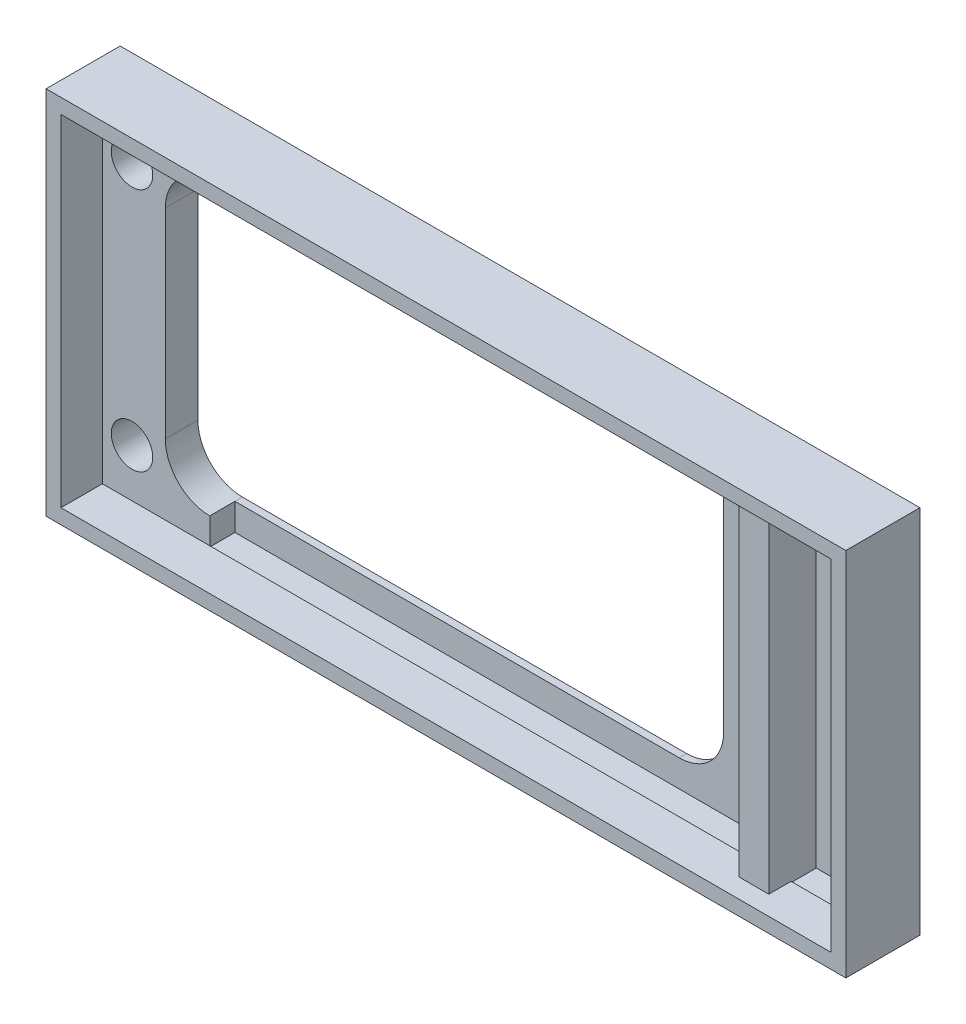
ISO-10303-21;
HEADER;
FILE_DESCRIPTION(('STEP AP214'),'2;1');
FILE_NAME('part.step','',(''),(''),'','','');
FILE_SCHEMA(('AUTOMOTIVE_DESIGN { 1 0 10303 214 1 1 1 1 }'));
ENDSEC;
DATA;
#1=APPLICATION_CONTEXT('core data for automotive mechanical design processes');
#2=APPLICATION_PROTOCOL_DEFINITION('international standard','automotive_design',2000,#1);
#3=PRODUCT_CONTEXT('',#1,'mechanical');
#4=PRODUCT('Part','Part','',(#3));
#5=PRODUCT_RELATED_PRODUCT_CATEGORY('part','',(#4));
#6=PRODUCT_DEFINITION_FORMATION('','',#4);
#7=PRODUCT_DEFINITION_CONTEXT('part definition',#1,'design');
#8=PRODUCT_DEFINITION('design','',#6,#7);
#9=PRODUCT_DEFINITION_SHAPE('','',#8);
#10=(LENGTH_UNIT() NAMED_UNIT(*) SI_UNIT(.MILLI.,.METRE.));
#11=(NAMED_UNIT(*) PLANE_ANGLE_UNIT() SI_UNIT($,.RADIAN.));
#12=(NAMED_UNIT(*) SI_UNIT($,.STERADIAN.) SOLID_ANGLE_UNIT());
#13=UNCERTAINTY_MEASURE_WITH_UNIT(LENGTH_MEASURE(1.E-05),#10,'distance_accuracy_value','');
#14=(GEOMETRIC_REPRESENTATION_CONTEXT(3) GLOBAL_UNCERTAINTY_ASSIGNED_CONTEXT((#13)) GLOBAL_UNIT_ASSIGNED_CONTEXT((#10,
#11,#12)) REPRESENTATION_CONTEXT('',''));
#15=CARTESIAN_POINT('',(0.,0.,0.));
#16=DIRECTION('',(0.,0.,1.));
#17=DIRECTION('',(1.,0.,0.));
#18=AXIS2_PLACEMENT_3D('',#15,#16,#17);
#19=CARTESIAN_POINT('',(-26.,11.5,5.));
#20=DIRECTION('',(0.,-1.,0.));
#21=DIRECTION('',(0.,0.,-1.));
#22=AXIS2_PLACEMENT_3D('',#19,#20,#21);
#23=PLANE('',#22);
#24=DIRECTION('',(-1.,0.,0.));
#25=VECTOR('',#24,1.);
#26=CARTESIAN_POINT('',(26.,11.5,0.5));
#27=LINE('',#26,#25);
#28=CARTESIAN_POINT('',(18.5,11.5,0.5));
#29=VERTEX_POINT('',#28);
#30=CARTESIAN_POINT('',(-18.75,11.5,0.5));
#31=VERTEX_POINT('',#30);
#32=EDGE_CURVE('E539',#29,#31,#27,.T.);
#33=ORIENTED_EDGE('',*,*,#32,.F.);
#34=DIRECTION('',(0.,0.,-1.));
#35=VECTOR('',#34,1.);
#36=CARTESIAN_POINT('',(18.5,11.5,3.7));
#37=LINE('',#36,#35);
#38=CARTESIAN_POINT('',(18.5,11.5,3.7));
#39=VERTEX_POINT('',#38);
#40=EDGE_CURVE('E59',#39,#29,#37,.T.);
#41=ORIENTED_EDGE('',*,*,#40,.F.);
#42=DIRECTION('',(-1.,0.,0.));
#43=VECTOR('',#42,1.);
#44=CARTESIAN_POINT('',(18.5,11.5,3.7));
#45=LINE('',#44,#43);
#46=CARTESIAN_POINT('',(20.5,11.5,3.7));
#47=VERTEX_POINT('',#46);
#48=EDGE_CURVE('E63',#47,#39,#45,.T.);
#49=ORIENTED_EDGE('',*,*,#48,.F.);
#50=DIRECTION('',(0.,0.,-1.));
#51=VECTOR('',#50,1.);
#52=CARTESIAN_POINT('',(20.5,11.5,3.7));
#53=LINE('',#52,#51);
#54=CARTESIAN_POINT('',(20.5,11.5,0.5));
#55=VERTEX_POINT('',#54);
#56=EDGE_CURVE('E570',#47,#55,#53,.T.);
#57=ORIENTED_EDGE('',*,*,#56,.T.);
#58=CARTESIAN_POINT('',(26.,11.5,0.5));
#59=VERTEX_POINT('',#58);
#60=EDGE_CURVE('E243',#59,#55,#27,.T.);
#61=ORIENTED_EDGE('',*,*,#60,.F.);
#62=DIRECTION('',(0.,0.,-1.));
#63=VECTOR('',#62,1.);
#64=CARTESIAN_POINT('',(26.,11.5,5.));
#65=LINE('',#64,#63);
#66=CARTESIAN_POINT('',(26.,11.5,5.));
#67=VERTEX_POINT('',#66);
#68=EDGE_CURVE('E333',#67,#59,#65,.T.);
#69=ORIENTED_EDGE('',*,*,#68,.F.);
#70=DIRECTION('',(-1.,0.,0.));
#71=VECTOR('',#70,1.);
#72=CARTESIAN_POINT('',(-26.,11.5,5.));
#73=LINE('',#72,#71);
#74=CARTESIAN_POINT('',(-26.,11.5,5.));
#75=VERTEX_POINT('',#74);
#76=EDGE_CURVE('E472',#67,#75,#73,.T.);
#77=ORIENTED_EDGE('',*,*,#76,.T.);
#78=DIRECTION('',(0.,0.,-1.));
#79=VECTOR('',#78,1.);
#80=CARTESIAN_POINT('',(-26.,11.5,5.));
#81=LINE('',#80,#79);
#82=CARTESIAN_POINT('',(-26.,11.5,2.2));
#83=VERTEX_POINT('',#82);
#84=EDGE_CURVE('E338',#75,#83,#81,.T.);
#85=ORIENTED_EDGE('',*,*,#84,.T.);
#86=DIRECTION('',(1.,0.,0.));
#87=VECTOR('',#86,1.);
#88=CARTESIAN_POINT('',(-26.,11.5,2.2));
#89=LINE('',#88,#87);
#90=CARTESIAN_POINT('',(-19.75,11.5,2.2));
#91=VERTEX_POINT('',#90);
#92=EDGE_CURVE('E467',#83,#91,#89,.T.);
#93=ORIENTED_EDGE('',*,*,#92,.T.);
#94=CARTESIAN_POINT('',(-19.75,11.5,1.2));
#95=DIRECTION('',(0.,-1.,0.));
#96=DIRECTION('',(0.,0.,-1.));
#97=AXIS2_PLACEMENT_3D('',#94,#95,#96);
#98=CIRCLE('',#97,1.);
#99=CARTESIAN_POINT('',(-18.75,11.5,1.2));
#100=VERTEX_POINT('',#99);
#101=EDGE_CURVE('E253',#91,#100,#98,.F.);
#102=ORIENTED_EDGE('',*,*,#101,.T.);
#103=DIRECTION('',(0.,0.,1.));
#104=VECTOR('',#103,1.);
#105=CARTESIAN_POINT('',(-18.75,11.5,0.5));
#106=LINE('',#105,#104);
#107=EDGE_CURVE('E372',#31,#100,#106,.T.);
#108=ORIENTED_EDGE('',*,*,#107,.F.);
#109=EDGE_LOOP('',(#33,#41,#49,#57,#61,#69,#77,#85,#93,#102,#108));
#110=FACE_BOUND('',#109,.T.);
#111=ADVANCED_FACE('F43',(#110),#23,.T.);
#112=CARTESIAN_POINT('',(-26.,-11.5,5.));
#113=DIRECTION('',(0.,1.,0.));
#114=DIRECTION('',(0.,0.,1.));
#115=AXIS2_PLACEMENT_3D('',#112,#113,#114);
#116=PLANE('',#115);
#117=DIRECTION('',(1.,0.,0.));
#118=VECTOR('',#117,1.);
#119=CARTESIAN_POINT('',(-26.,-11.5,3.7));
#120=LINE('',#119,#118);
#121=CARTESIAN_POINT('',(18.5,-11.5,3.7));
#122=VERTEX_POINT('',#121);
#123=CARTESIAN_POINT('',(20.5,-11.5,3.7));
#124=VERTEX_POINT('',#123);
#125=EDGE_CURVE('E11',#122,#124,#120,.T.);
#126=ORIENTED_EDGE('',*,*,#125,.F.);
#127=DIRECTION('',(0.,0.,-1.));
#128=VECTOR('',#127,1.);
#129=CARTESIAN_POINT('',(18.5,-11.5,5.));
#130=LINE('',#129,#128);
#131=CARTESIAN_POINT('',(18.5,-11.5,2.2));
#132=VERTEX_POINT('',#131);
#133=EDGE_CURVE('E550',#122,#132,#130,.T.);
#134=ORIENTED_EDGE('',*,*,#133,.T.);
#135=DIRECTION('',(-1.,0.,0.));
#136=VECTOR('',#135,1.);
#137=CARTESIAN_POINT('',(-26.,-11.5,2.2));
#138=LINE('',#137,#136);
#139=CARTESIAN_POINT('',(-18.75,-11.5,2.2));
#140=VERTEX_POINT('',#139);
#141=EDGE_CURVE('E358',#132,#140,#138,.T.);
#142=ORIENTED_EDGE('',*,*,#141,.T.);
#143=CARTESIAN_POINT('',(-26.,-11.5,2.2));
#144=VERTEX_POINT('',#143);
#145=EDGE_CURVE('E355',#140,#144,#138,.T.);
#146=ORIENTED_EDGE('',*,*,#145,.T.);
#147=DIRECTION('',(0.,0.,-1.));
#148=VECTOR('',#147,1.);
#149=CARTESIAN_POINT('',(-26.,-11.5,5.));
#150=LINE('',#149,#148);
#151=CARTESIAN_POINT('',(-26.,-11.5,5.));
#152=VERTEX_POINT('',#151);
#153=EDGE_CURVE('E482',#152,#144,#150,.T.);
#154=ORIENTED_EDGE('',*,*,#153,.F.);
#155=DIRECTION('',(1.,0.,0.));
#156=VECTOR('',#155,1.);
#157=CARTESIAN_POINT('',(-26.,-11.5,5.));
#158=LINE('',#157,#156);
#159=CARTESIAN_POINT('',(26.,-11.5,5.));
#160=VERTEX_POINT('',#159);
#161=EDGE_CURVE('E477',#152,#160,#158,.T.);
#162=ORIENTED_EDGE('',*,*,#161,.T.);
#163=DIRECTION('',(0.,0.,-1.));
#164=VECTOR('',#163,1.);
#165=CARTESIAN_POINT('',(26.,-11.5,5.));
#166=LINE('',#165,#164);
#167=CARTESIAN_POINT('',(26.,-11.5,2.2));
#168=VERTEX_POINT('',#167);
#169=EDGE_CURVE('E479',#160,#168,#166,.T.);
#170=ORIENTED_EDGE('',*,*,#169,.T.);
#171=CARTESIAN_POINT('',(20.5,-11.5,2.2));
#172=VERTEX_POINT('',#171);
#173=EDGE_CURVE('E356',#168,#172,#138,.T.);
#174=ORIENTED_EDGE('',*,*,#173,.T.);
#175=DIRECTION('',(0.,0.,1.));
#176=VECTOR('',#175,1.);
#177=CARTESIAN_POINT('',(20.5,-11.5,5.));
#178=LINE('',#177,#176);
#179=EDGE_CURVE('E567',#172,#124,#178,.T.);
#180=ORIENTED_EDGE('',*,*,#179,.T.);
#181=EDGE_LOOP('',(#126,#134,#142,#146,#154,#162,#170,#174,#180));
#182=FACE_BOUND('',#181,.T.);
#183=ADVANCED_FACE('F283',(#182),#116,.T.);
#184=CARTESIAN_POINT('',(0.,0.,0.5));
#185=DIRECTION('',(0.,0.,-1.));
#186=DIRECTION('',(-1.,0.,0.));
#187=AXIS2_PLACEMENT_3D('',#184,#185,#186);
#188=PLANE('',#187);
#189=DIRECTION('',(0.,-1.,0.));
#190=VECTOR('',#189,1.);
#191=CARTESIAN_POINT('',(18.5,11.5,0.5));
#192=LINE('',#191,#190);
#193=CARTESIAN_POINT('',(18.5,-11.5719370602204,0.5));
#194=VERTEX_POINT('',#193);
#195=EDGE_CURVE('E247',#29,#194,#192,.T.);
#196=ORIENTED_EDGE('',*,*,#195,.F.);
#197=ORIENTED_EDGE('',*,*,#32,.T.);
#198=DIRECTION('',(0.,-1.,0.));
#199=VECTOR('',#198,1.);
#200=CARTESIAN_POINT('',(-18.75,11.5,0.5));
#201=LINE('',#200,#199);
#202=CARTESIAN_POINT('',(-18.75,9.75,0.5));
#203=VERTEX_POINT('',#202);
#204=EDGE_CURVE('E236',#31,#203,#201,.T.);
#205=ORIENTED_EDGE('',*,*,#204,.T.);
#206=DIRECTION('',(-1.,0.,0.));
#207=VECTOR('',#206,1.);
#208=CARTESIAN_POINT('',(11.25,9.75,0.5));
#209=LINE('',#208,#207);
#210=CARTESIAN_POINT('',(11.25,9.75,0.5));
#211=VERTEX_POINT('',#210);
#212=EDGE_CURVE('E365',#211,#203,#209,.T.);
#213=ORIENTED_EDGE('',*,*,#212,.F.);
#214=CARTESIAN_POINT('',(11.25,6.75,0.5));
#215=DIRECTION('',(0.,0.,-1.));
#216=DIRECTION('',(-1.,0.,0.));
#217=AXIS2_PLACEMENT_3D('',#214,#215,#216);
#218=CIRCLE('',#217,3.);
#219=CARTESIAN_POINT('',(14.25,6.75,0.5));
#220=VERTEX_POINT('',#219);
#221=EDGE_CURVE('E382',#220,#211,#218,.F.);
#222=ORIENTED_EDGE('',*,*,#221,.F.);
#223=DIRECTION('',(0.,1.,0.));
#224=VECTOR('',#223,1.);
#225=CARTESIAN_POINT('',(14.25,-6.75,0.5));
#226=LINE('',#225,#224);
#227=CARTESIAN_POINT('',(14.25,-6.75,0.5));
#228=VERTEX_POINT('',#227);
#229=EDGE_CURVE('E385',#228,#220,#226,.T.);
#230=ORIENTED_EDGE('',*,*,#229,.F.);
#231=CARTESIAN_POINT('',(11.25,-6.75,0.5));
#232=DIRECTION('',(0.,0.,-1.));
#233=DIRECTION('',(-1.,0.,0.));
#234=AXIS2_PLACEMENT_3D('',#231,#232,#233);
#235=CIRCLE('',#234,3.);
#236=CARTESIAN_POINT('',(11.25,-9.75,0.5));
#237=VERTEX_POINT('',#236);
#238=EDGE_CURVE('E388',#237,#228,#235,.F.);
#239=ORIENTED_EDGE('',*,*,#238,.F.);
#240=DIRECTION('',(1.,0.,0.));
#241=VECTOR('',#240,1.);
#242=CARTESIAN_POINT('',(11.25,-9.75,0.5));
#243=LINE('',#242,#241);
#244=CARTESIAN_POINT('',(-18.75,-9.75,0.5));
#245=VERTEX_POINT('',#244);
#246=EDGE_CURVE('E391',#245,#237,#243,.T.);
#247=ORIENTED_EDGE('',*,*,#246,.F.);
#248=CARTESIAN_POINT('',(-18.75,-11.5719370602204,0.5));
#249=VERTEX_POINT('',#248);
#250=EDGE_CURVE('E542',#245,#249,#201,.T.);
#251=ORIENTED_EDGE('',*,*,#250,.T.);
#252=DIRECTION('',(1.,0.,0.));
#253=VECTOR('',#252,1.);
#254=CARTESIAN_POINT('',(26.,-11.5719370602204,0.5));
#255=LINE('',#254,#253);
#256=EDGE_CURVE('E235',#249,#194,#255,.T.);
#257=ORIENTED_EDGE('',*,*,#256,.T.);
#258=EDGE_LOOP('',(#196,#197,#205,#213,#222,#230,#239,#247,#251,#257));
#259=FACE_BOUND('',#258,.T.);
#260=ADVANCED_FACE('F286',(#259),#188,.F.);
#261=CARTESIAN_POINT('',(23.,8.24999999999999,0.5));
#262=DIRECTION('',(0.,0.,-1.));
#263=DIRECTION('',(-1.,0.,0.));
#264=AXIS2_PLACEMENT_3D('',#261,#262,#263);
#265=CIRCLE('',#264,1.4);
#266=CARTESIAN_POINT('',(21.6,8.24999999999999,0.5));
#267=VERTEX_POINT('',#266);
#268=EDGE_CURVE('E361',#267,#267,#265,.F.);
#269=ORIENTED_EDGE('',*,*,#268,.F.);
#270=EDGE_LOOP('',(#269));
#271=FACE_BOUND('',#270,.T.);
#272=CARTESIAN_POINT('',(23.,-8.25000000000001,0.5));
#273=DIRECTION('',(0.,0.,-1.));
#274=DIRECTION('',(-1.,0.,0.));
#275=AXIS2_PLACEMENT_3D('',#272,#273,#274);
#276=CIRCLE('',#275,1.4);
#277=CARTESIAN_POINT('',(21.6,-8.25000000000001,0.5));
#278=VERTEX_POINT('',#277);
#279=EDGE_CURVE('E359',#278,#278,#276,.F.);
#280=ORIENTED_EDGE('',*,*,#279,.F.);
#281=EDGE_LOOP('',(#280));
#282=FACE_BOUND('',#281,.T.);
#283=DIRECTION('',(0.,1.,0.));
#284=VECTOR('',#283,1.);
#285=CARTESIAN_POINT('',(20.5,11.5,0.5));
#286=LINE('',#285,#284);
#287=CARTESIAN_POINT('',(20.5,-11.5719370602204,0.5));
#288=VERTEX_POINT('',#287);
#289=EDGE_CURVE('E240',#288,#55,#286,.T.);
#290=ORIENTED_EDGE('',*,*,#289,.F.);
#291=CARTESIAN_POINT('',(26.,-11.5719370602204,0.5));
#292=VERTEX_POINT('',#291);
#293=EDGE_CURVE('E224',#288,#292,#255,.T.);
#294=ORIENTED_EDGE('',*,*,#293,.T.);
#295=DIRECTION('',(0.,1.,0.));
#296=VECTOR('',#295,1.);
#297=CARTESIAN_POINT('',(26.,11.5,0.5));
#298=LINE('',#297,#296);
#299=EDGE_CURVE('E560',#292,#59,#298,.T.);
#300=ORIENTED_EDGE('',*,*,#299,.T.);
#301=ORIENTED_EDGE('',*,*,#60,.T.);
#302=EDGE_LOOP('',(#290,#294,#300,#301));
#303=FACE_BOUND('',#302,.T.);
#304=ADVANCED_FACE('F241',(#271,#282,#303),#188,.F.);
#305=CARTESIAN_POINT('',(0.,0.,2.2));
#306=DIRECTION('',(0.,0.,-1.));
#307=DIRECTION('',(-1.,0.,0.));
#308=AXIS2_PLACEMENT_3D('',#305,#306,#307);
#309=PLANE('',#308);
#310=ORIENTED_EDGE('',*,*,#141,.F.);
#311=DIRECTION('',(0.,-1.,0.));
#312=VECTOR('',#311,1.);
#313=CARTESIAN_POINT('',(18.5,0.,2.2));
#314=LINE('',#313,#312);
#315=CARTESIAN_POINT('',(18.5,-11.5719370602204,2.2));
#316=VERTEX_POINT('',#315);
#317=EDGE_CURVE('E565',#132,#316,#314,.T.);
#318=ORIENTED_EDGE('',*,*,#317,.T.);
#319=DIRECTION('',(1.,0.,0.));
#320=VECTOR('',#319,1.);
#321=CARTESIAN_POINT('',(26.,-11.5719370602204,2.2));
#322=LINE('',#321,#320);
#323=CARTESIAN_POINT('',(-18.75,-11.5719370602204,2.2));
#324=VERTEX_POINT('',#323);
#325=EDGE_CURVE('E375',#324,#316,#322,.T.);
#326=ORIENTED_EDGE('',*,*,#325,.F.);
#327=DIRECTION('',(0.,-1.,0.));
#328=VECTOR('',#327,1.);
#329=CARTESIAN_POINT('',(-18.75,11.5,2.2));
#330=LINE('',#329,#328);
#331=EDGE_CURVE('E549',#140,#324,#330,.T.);
#332=ORIENTED_EDGE('',*,*,#331,.F.);
#333=EDGE_LOOP('',(#310,#318,#326,#332));
#334=FACE_BOUND('',#333,.T.);
#335=ADVANCED_FACE('F589',(#334),#309,.T.);
#336=CARTESIAN_POINT('',(20.5,-11.5719370602204,2.2));
#337=VERTEX_POINT('',#336);
#338=CARTESIAN_POINT('',(26.,-11.5719370602204,2.2));
#339=VERTEX_POINT('',#338);
#340=EDGE_CURVE('E556',#337,#339,#322,.T.);
#341=ORIENTED_EDGE('',*,*,#340,.F.);
#342=DIRECTION('',(0.,1.,0.));
#343=VECTOR('',#342,1.);
#344=CARTESIAN_POINT('',(20.5,0.,2.2));
#345=LINE('',#344,#343);
#346=EDGE_CURVE('E252',#337,#172,#345,.T.);
#347=ORIENTED_EDGE('',*,*,#346,.T.);
#348=ORIENTED_EDGE('',*,*,#173,.F.);
#349=DIRECTION('',(0.,1.,0.));
#350=VECTOR('',#349,1.);
#351=CARTESIAN_POINT('',(26.,11.5,2.2));
#352=LINE('',#351,#350);
#353=EDGE_CURVE('E548',#339,#168,#352,.T.);
#354=ORIENTED_EDGE('',*,*,#353,.F.);
#355=EDGE_LOOP('',(#341,#347,#348,#354));
#356=FACE_BOUND('',#355,.T.);
#357=ADVANCED_FACE('F600',(#356),#309,.T.);
#358=CARTESIAN_POINT('',(26.,-11.5719370602204,0.5));
#359=DIRECTION('',(0.,-1.,0.));
#360=DIRECTION('',(1.,0.,0.));
#361=AXIS2_PLACEMENT_3D('',#358,#359,#360);
#362=PLANE('',#361);
#363=DIRECTION('',(0.,0.,1.));
#364=VECTOR('',#363,1.);
#365=CARTESIAN_POINT('',(18.5,-11.5719370602204,0.5));
#366=LINE('',#365,#364);
#367=EDGE_CURVE('E52',#194,#316,#366,.T.);
#368=ORIENTED_EDGE('',*,*,#367,.F.);
#369=ORIENTED_EDGE('',*,*,#256,.F.);
#370=DIRECTION('',(0.,0.,1.));
#371=VECTOR('',#370,1.);
#372=CARTESIAN_POINT('',(-18.75,-11.5719370602204,0.5));
#373=LINE('',#372,#371);
#374=EDGE_CURVE('E367',#249,#324,#373,.T.);
#375=ORIENTED_EDGE('',*,*,#374,.T.);
#376=ORIENTED_EDGE('',*,*,#325,.T.);
#377=EDGE_LOOP('',(#368,#369,#375,#376));
#378=FACE_BOUND('',#377,.T.);
#379=ADVANCED_FACE('F610',(#378),#362,.F.);
#380=DIRECTION('',(0.,0.,-1.));
#381=VECTOR('',#380,1.);
#382=CARTESIAN_POINT('',(20.5,-11.5719370602204,0.5));
#383=LINE('',#382,#381);
#384=EDGE_CURVE('E228',#337,#288,#383,.T.);
#385=ORIENTED_EDGE('',*,*,#384,.F.);
#386=ORIENTED_EDGE('',*,*,#340,.T.);
#387=DIRECTION('',(0.,0.,1.));
#388=VECTOR('',#387,1.);
#389=CARTESIAN_POINT('',(26.,-11.5719370602204,0.5));
#390=LINE('',#389,#388);
#391=EDGE_CURVE('E231',#292,#339,#390,.T.);
#392=ORIENTED_EDGE('',*,*,#391,.F.);
#393=ORIENTED_EDGE('',*,*,#293,.F.);
#394=EDGE_LOOP('',(#385,#386,#392,#393));
#395=FACE_BOUND('',#394,.T.);
#396=ADVANCED_FACE('F226',(#395),#362,.F.);
#397=CARTESIAN_POINT('',(26.,-11.5,5.));
#398=DIRECTION('',(-1.,0.,0.));
#399=DIRECTION('',(0.,0.,1.));
#400=AXIS2_PLACEMENT_3D('',#397,#398,#399);
#401=PLANE('',#400);
#402=ORIENTED_EDGE('',*,*,#68,.T.);
#403=ORIENTED_EDGE('',*,*,#299,.F.);
#404=ORIENTED_EDGE('',*,*,#391,.T.);
#405=ORIENTED_EDGE('',*,*,#353,.T.);
#406=ORIENTED_EDGE('',*,*,#169,.F.);
#407=DIRECTION('',(0.,1.,0.));
#408=VECTOR('',#407,1.);
#409=CARTESIAN_POINT('',(26.,-11.5,5.));
#410=LINE('',#409,#408);
#411=EDGE_CURVE('E470',#160,#67,#410,.T.);
#412=ORIENTED_EDGE('',*,*,#411,.T.);
#413=EDGE_LOOP('',(#402,#403,#404,#405,#406,#412));
#414=FACE_BOUND('',#413,.T.);
#415=ADVANCED_FACE('F292',(#414),#401,.T.);
#416=CARTESIAN_POINT('',(-26.,-11.5,5.));
#417=DIRECTION('',(1.,0.,0.));
#418=DIRECTION('',(0.,0.,-1.));
#419=AXIS2_PLACEMENT_3D('',#416,#417,#418);
#420=PLANE('',#419);
#421=ORIENTED_EDGE('',*,*,#153,.T.);
#422=DIRECTION('',(0.,1.,0.));
#423=VECTOR('',#422,1.);
#424=CARTESIAN_POINT('',(-26.,-11.5,2.2));
#425=LINE('',#424,#423);
#426=EDGE_CURVE('E448',#144,#83,#425,.T.);
#427=ORIENTED_EDGE('',*,*,#426,.T.);
#428=ORIENTED_EDGE('',*,*,#84,.F.);
#429=DIRECTION('',(0.,-1.,0.));
#430=VECTOR('',#429,1.);
#431=CARTESIAN_POINT('',(-26.,-11.5,5.));
#432=LINE('',#431,#430);
#433=EDGE_CURVE('E474',#75,#152,#432,.T.);
#434=ORIENTED_EDGE('',*,*,#433,.T.);
#435=EDGE_LOOP('',(#421,#427,#428,#434));
#436=FACE_BOUND('',#435,.T.);
#437=ADVANCED_FACE('F288',(#436),#420,.T.);
#438=CARTESIAN_POINT('',(0.,0.,5.));
#439=DIRECTION('',(0.,0.,-1.));
#440=DIRECTION('',(-1.,0.,0.));
#441=AXIS2_PLACEMENT_3D('',#438,#439,#440);
#442=PLANE('',#441);
#443=DIRECTION('',(0.,1.,0.));
#444=VECTOR('',#443,1.);
#445=CARTESIAN_POINT('',(27.,-12.5,5.));
#446=LINE('',#445,#444);
#447=CARTESIAN_POINT('',(27.,-12.5,5.));
#448=VERTEX_POINT('',#447);
#449=CARTESIAN_POINT('',(27.,12.5,5.));
#450=VERTEX_POINT('',#449);
#451=EDGE_CURVE('E348',#448,#450,#446,.T.);
#452=ORIENTED_EDGE('',*,*,#451,.T.);
#453=DIRECTION('',(-1.,0.,0.));
#454=VECTOR('',#453,1.);
#455=CARTESIAN_POINT('',(-27.,12.5,5.));
#456=LINE('',#455,#454);
#457=CARTESIAN_POINT('',(-27.,12.5,5.));
#458=VERTEX_POINT('',#457);
#459=EDGE_CURVE('E489',#450,#458,#456,.T.);
#460=ORIENTED_EDGE('',*,*,#459,.T.);
#461=DIRECTION('',(0.,-1.,0.));
#462=VECTOR('',#461,1.);
#463=CARTESIAN_POINT('',(-27.,-12.5,5.));
#464=LINE('',#463,#462);
#465=CARTESIAN_POINT('',(-27.,-12.5,5.));
#466=VERTEX_POINT('',#465);
#467=EDGE_CURVE('E490',#458,#466,#464,.T.);
#468=ORIENTED_EDGE('',*,*,#467,.T.);
#469=DIRECTION('',(1.,0.,0.));
#470=VECTOR('',#469,1.);
#471=CARTESIAN_POINT('',(-27.,-12.5,5.));
#472=LINE('',#471,#470);
#473=EDGE_CURVE('E341',#466,#448,#472,.T.);
#474=ORIENTED_EDGE('',*,*,#473,.T.);
#475=EDGE_LOOP('',(#452,#460,#468,#474));
#476=FACE_BOUND('',#475,.T.);
#477=ORIENTED_EDGE('',*,*,#411,.F.);
#478=ORIENTED_EDGE('',*,*,#161,.F.);
#479=ORIENTED_EDGE('',*,*,#433,.F.);
#480=ORIENTED_EDGE('',*,*,#76,.F.);
#481=EDGE_LOOP('',(#477,#478,#479,#480));
#482=FACE_BOUND('',#481,.T.);
#483=ADVANCED_FACE('F291',(#476,#482),#442,.F.);
#484=CARTESIAN_POINT('',(0.,0.,0.));
#485=DIRECTION('',(0.,0.,-1.));
#486=DIRECTION('',(-1.,0.,0.));
#487=AXIS2_PLACEMENT_3D('',#484,#485,#486);
#488=PLANE('',#487);
#489=DIRECTION('',(0.,1.,0.));
#490=VECTOR('',#489,1.);
#491=CARTESIAN_POINT('',(27.,-12.5,0.));
#492=LINE('',#491,#490);
#493=CARTESIAN_POINT('',(27.,-12.5,0.));
#494=VERTEX_POINT('',#493);
#495=CARTESIAN_POINT('',(27.,12.5,0.));
#496=VERTEX_POINT('',#495);
#497=EDGE_CURVE('E324',#494,#496,#492,.T.);
#498=ORIENTED_EDGE('',*,*,#497,.F.);
#499=DIRECTION('',(1.,0.,0.));
#500=VECTOR('',#499,1.);
#501=CARTESIAN_POINT('',(-27.,-12.5,0.));
#502=LINE('',#501,#500);
#503=CARTESIAN_POINT('',(-27.,-12.5,0.));
#504=VERTEX_POINT('',#503);
#505=EDGE_CURVE('E346',#504,#494,#502,.T.);
#506=ORIENTED_EDGE('',*,*,#505,.F.);
#507=DIRECTION('',(0.,-1.,0.));
#508=VECTOR('',#507,1.);
#509=CARTESIAN_POINT('',(-27.,-12.5,0.));
#510=LINE('',#509,#508);
#511=CARTESIAN_POINT('',(-27.,12.5,0.));
#512=VERTEX_POINT('',#511);
#513=EDGE_CURVE('E336',#512,#504,#510,.T.);
#514=ORIENTED_EDGE('',*,*,#513,.F.);
#515=DIRECTION('',(-1.,0.,0.));
#516=VECTOR('',#515,1.);
#517=CARTESIAN_POINT('',(-27.,12.5,0.));
#518=LINE('',#517,#516);
#519=EDGE_CURVE('E332',#496,#512,#518,.T.);
#520=ORIENTED_EDGE('',*,*,#519,.F.);
#521=EDGE_LOOP('',(#498,#506,#514,#520));
#522=FACE_BOUND('',#521,.T.);
#523=CARTESIAN_POINT('',(23.,-8.25000000000001,0.));
#524=DIRECTION('',(0.,0.,-1.));
#525=DIRECTION('',(-1.,0.,0.));
#526=AXIS2_PLACEMENT_3D('',#523,#524,#525);
#527=CIRCLE('',#526,1.4);
#528=CARTESIAN_POINT('',(21.6,-8.25000000000001,0.));
#529=VERTEX_POINT('',#528);
#530=EDGE_CURVE('E394',#529,#529,#527,.T.);
#531=ORIENTED_EDGE('',*,*,#530,.F.);
#532=EDGE_LOOP('',(#531));
#533=FACE_BOUND('',#532,.T.);
#534=CARTESIAN_POINT('',(23.,8.24999999999999,0.));
#535=DIRECTION('',(0.,0.,-1.));
#536=DIRECTION('',(-1.,0.,0.));
#537=AXIS2_PLACEMENT_3D('',#534,#535,#536);
#538=CIRCLE('',#537,1.4);
#539=CARTESIAN_POINT('',(21.6,8.24999999999999,0.));
#540=VERTEX_POINT('',#539);
#541=EDGE_CURVE('E397',#540,#540,#538,.T.);
#542=ORIENTED_EDGE('',*,*,#541,.F.);
#543=EDGE_LOOP('',(#542));
#544=FACE_BOUND('',#543,.T.);
#545=CARTESIAN_POINT('',(-24.,-8.25000000000001,0.));
#546=DIRECTION('',(0.,0.,-1.));
#547=DIRECTION('',(-1.,0.,0.));
#548=AXIS2_PLACEMENT_3D('',#545,#546,#547);
#549=CIRCLE('',#548,1.4);
#550=CARTESIAN_POINT('',(-25.4,-8.25000000000001,0.));
#551=VERTEX_POINT('',#550);
#552=EDGE_CURVE('E400',#551,#551,#549,.T.);
#553=ORIENTED_EDGE('',*,*,#552,.F.);
#554=EDGE_LOOP('',(#553));
#555=FACE_BOUND('',#554,.T.);
#556=CARTESIAN_POINT('',(-24.,8.24999999999999,0.));
#557=DIRECTION('',(0.,0.,-1.));
#558=DIRECTION('',(-1.,0.,0.));
#559=AXIS2_PLACEMENT_3D('',#556,#557,#558);
#560=CIRCLE('',#559,1.4);
#561=CARTESIAN_POINT('',(-25.4,8.24999999999999,0.));
#562=VERTEX_POINT('',#561);
#563=EDGE_CURVE('E404',#562,#562,#560,.T.);
#564=ORIENTED_EDGE('',*,*,#563,.F.);
#565=EDGE_LOOP('',(#564));
#566=FACE_BOUND('',#565,.T.);
#567=CARTESIAN_POINT('',(-18.75,6.75,0.));
#568=DIRECTION('',(0.,0.,-1.));
#569=DIRECTION('',(1.,0.,0.));
#570=AXIS2_PLACEMENT_3D('',#567,#568,#569);
#571=CIRCLE('',#570,3.);
#572=CARTESIAN_POINT('',(-21.75,6.75,0.));
#573=VERTEX_POINT('',#572);
#574=CARTESIAN_POINT('',(-18.75,9.75,0.));
#575=VERTEX_POINT('',#574);
#576=EDGE_CURVE('E410',#573,#575,#571,.T.);
#577=ORIENTED_EDGE('',*,*,#576,.F.);
#578=DIRECTION('',(0.,1.,0.));
#579=VECTOR('',#578,1.);
#580=CARTESIAN_POINT('',(-21.75,-6.75,0.));
#581=LINE('',#580,#579);
#582=CARTESIAN_POINT('',(-21.75,-6.75,0.));
#583=VERTEX_POINT('',#582);
#584=EDGE_CURVE('E417',#583,#573,#581,.T.);
#585=ORIENTED_EDGE('',*,*,#584,.F.);
#586=CARTESIAN_POINT('',(-18.75,-6.75,0.));
#587=DIRECTION('',(0.,0.,-1.));
#588=DIRECTION('',(-1.,0.,0.));
#589=AXIS2_PLACEMENT_3D('',#586,#587,#588);
#590=CIRCLE('',#589,3.);
#591=CARTESIAN_POINT('',(-18.75,-9.75,0.));
#592=VERTEX_POINT('',#591);
#593=EDGE_CURVE('E441',#592,#583,#590,.T.);
#594=ORIENTED_EDGE('',*,*,#593,.F.);
#595=DIRECTION('',(-1.,0.,0.));
#596=VECTOR('',#595,1.);
#597=CARTESIAN_POINT('',(11.25,-9.75,0.));
#598=LINE('',#597,#596);
#599=CARTESIAN_POINT('',(11.25,-9.75,0.));
#600=VERTEX_POINT('',#599);
#601=EDGE_CURVE('E438',#600,#592,#598,.T.);
#602=ORIENTED_EDGE('',*,*,#601,.F.);
#603=CARTESIAN_POINT('',(11.25,-6.75,0.));
#604=DIRECTION('',(0.,0.,-1.));
#605=DIRECTION('',(1.,0.,0.));
#606=AXIS2_PLACEMENT_3D('',#603,#604,#605);
#607=CIRCLE('',#606,3.);
#608=CARTESIAN_POINT('',(14.25,-6.75,0.));
#609=VERTEX_POINT('',#608);
#610=EDGE_CURVE('E435',#609,#600,#607,.T.);
#611=ORIENTED_EDGE('',*,*,#610,.F.);
#612=DIRECTION('',(0.,-1.,0.));
#613=VECTOR('',#612,1.);
#614=CARTESIAN_POINT('',(14.25,-6.75,0.));
#615=LINE('',#614,#613);
#616=CARTESIAN_POINT('',(14.25,6.75,0.));
#617=VERTEX_POINT('',#616);
#618=EDGE_CURVE('E432',#617,#609,#615,.T.);
#619=ORIENTED_EDGE('',*,*,#618,.F.);
#620=CARTESIAN_POINT('',(11.25,6.75,0.));
#621=DIRECTION('',(0.,0.,-1.));
#622=DIRECTION('',(1.,0.,0.));
#623=AXIS2_PLACEMENT_3D('',#620,#621,#622);
#624=CIRCLE('',#623,3.);
#625=CARTESIAN_POINT('',(11.25,9.75,0.));
#626=VERTEX_POINT('',#625);
#627=EDGE_CURVE('E429',#626,#617,#624,.T.);
#628=ORIENTED_EDGE('',*,*,#627,.F.);
#629=DIRECTION('',(1.,0.,0.));
#630=VECTOR('',#629,1.);
#631=CARTESIAN_POINT('',(11.25,9.75,0.));
#632=LINE('',#631,#630);
#633=EDGE_CURVE('E426',#575,#626,#632,.T.);
#634=ORIENTED_EDGE('',*,*,#633,.F.);
#635=EDGE_LOOP('',(#577,#585,#594,#602,#611,#619,#628,#634));
#636=FACE_BOUND('',#635,.T.);
#637=ADVANCED_FACE('F301',(#522,#533,#544,#555,#566,#636),#488,.T.);
#638=CARTESIAN_POINT('',(27.,-12.5,5.));
#639=DIRECTION('',(-1.,0.,0.));
#640=DIRECTION('',(0.,0.,1.));
#641=AXIS2_PLACEMENT_3D('',#638,#639,#640);
#642=PLANE('',#641);
#643=ORIENTED_EDGE('',*,*,#497,.T.);
#644=DIRECTION('',(0.,0.,-1.));
#645=VECTOR('',#644,1.);
#646=CARTESIAN_POINT('',(27.,12.5,5.));
#647=LINE('',#646,#645);
#648=EDGE_CURVE('E326',#450,#496,#647,.T.);
#649=ORIENTED_EDGE('',*,*,#648,.F.);
#650=ORIENTED_EDGE('',*,*,#451,.F.);
#651=DIRECTION('',(0.,0.,-1.));
#652=VECTOR('',#651,1.);
#653=CARTESIAN_POINT('',(27.,-12.5,5.));
#654=LINE('',#653,#652);
#655=EDGE_CURVE('E328',#448,#494,#654,.T.);
#656=ORIENTED_EDGE('',*,*,#655,.T.);
#657=EDGE_LOOP('',(#643,#649,#650,#656));
#658=FACE_BOUND('',#657,.T.);
#659=ADVANCED_FACE('F305',(#658),#642,.F.);
#660=CARTESIAN_POINT('',(-27.,12.5,5.));
#661=DIRECTION('',(0.,-1.,0.));
#662=DIRECTION('',(0.,0.,-1.));
#663=AXIS2_PLACEMENT_3D('',#660,#661,#662);
#664=PLANE('',#663);
#665=ORIENTED_EDGE('',*,*,#519,.T.);
#666=DIRECTION('',(0.,0.,-1.));
#667=VECTOR('',#666,1.);
#668=CARTESIAN_POINT('',(-27.,12.5,5.));
#669=LINE('',#668,#667);
#670=EDGE_CURVE('E352',#458,#512,#669,.T.);
#671=ORIENTED_EDGE('',*,*,#670,.F.);
#672=ORIENTED_EDGE('',*,*,#459,.F.);
#673=ORIENTED_EDGE('',*,*,#648,.T.);
#674=EDGE_LOOP('',(#665,#671,#672,#673));
#675=FACE_BOUND('',#674,.T.);
#676=ADVANCED_FACE('F313',(#675),#664,.F.);
#677=CARTESIAN_POINT('',(-27.,-12.5,5.));
#678=DIRECTION('',(1.,0.,0.));
#679=DIRECTION('',(0.,0.,-1.));
#680=AXIS2_PLACEMENT_3D('',#677,#678,#679);
#681=PLANE('',#680);
#682=ORIENTED_EDGE('',*,*,#513,.T.);
#683=DIRECTION('',(0.,0.,-1.));
#684=VECTOR('',#683,1.);
#685=CARTESIAN_POINT('',(-27.,-12.5,5.));
#686=LINE('',#685,#684);
#687=EDGE_CURVE('E350',#466,#504,#686,.T.);
#688=ORIENTED_EDGE('',*,*,#687,.F.);
#689=ORIENTED_EDGE('',*,*,#467,.F.);
#690=ORIENTED_EDGE('',*,*,#670,.T.);
#691=EDGE_LOOP('',(#682,#688,#689,#690));
#692=FACE_BOUND('',#691,.T.);
#693=ADVANCED_FACE('F309',(#692),#681,.F.);
#694=CARTESIAN_POINT('',(-27.,-12.5,5.));
#695=DIRECTION('',(0.,1.,0.));
#696=DIRECTION('',(0.,0.,1.));
#697=AXIS2_PLACEMENT_3D('',#694,#695,#696);
#698=PLANE('',#697);
#699=ORIENTED_EDGE('',*,*,#505,.T.);
#700=ORIENTED_EDGE('',*,*,#655,.F.);
#701=ORIENTED_EDGE('',*,*,#473,.F.);
#702=ORIENTED_EDGE('',*,*,#687,.T.);
#703=EDGE_LOOP('',(#699,#700,#701,#702));
#704=FACE_BOUND('',#703,.T.);
#705=ADVANCED_FACE('F281',(#704),#698,.F.);
#706=CARTESIAN_POINT('',(0.,0.,2.2));
#707=DIRECTION('',(0.,0.,-1.));
#708=DIRECTION('',(-1.,0.,0.));
#709=AXIS2_PLACEMENT_3D('',#706,#707,#708);
#710=PLANE('',#709);
#711=CARTESIAN_POINT('',(-24.,-8.25000000000001,2.2));
#712=DIRECTION('',(0.,0.,-1.));
#713=DIRECTION('',(-1.,0.,0.));
#714=AXIS2_PLACEMENT_3D('',#711,#712,#713);
#715=CIRCLE('',#714,1.4);
#716=CARTESIAN_POINT('',(-25.4,-8.25000000000001,2.2));
#717=VERTEX_POINT('',#716);
#718=EDGE_CURVE('E401',#717,#717,#715,.T.);
#719=ORIENTED_EDGE('',*,*,#718,.T.);
#720=EDGE_LOOP('',(#719));
#721=FACE_BOUND('',#720,.T.);
#722=CARTESIAN_POINT('',(-24.,8.24999999999999,2.2));
#723=DIRECTION('',(0.,0.,-1.));
#724=DIRECTION('',(-1.,0.,0.));
#725=AXIS2_PLACEMENT_3D('',#722,#723,#724);
#726=CIRCLE('',#725,1.4);
#727=CARTESIAN_POINT('',(-25.4,8.24999999999999,2.2));
#728=VERTEX_POINT('',#727);
#729=EDGE_CURVE('E407',#728,#728,#726,.T.);
#730=ORIENTED_EDGE('',*,*,#729,.T.);
#731=EDGE_LOOP('',(#730));
#732=FACE_BOUND('',#731,.T.);
#733=CARTESIAN_POINT('',(-18.75,6.75,2.2));
#734=DIRECTION('',(0.,0.,-1.));
#735=DIRECTION('',(1.,0.,0.));
#736=AXIS2_PLACEMENT_3D('',#733,#734,#735);
#737=CIRCLE('',#736,3.);
#738=CARTESIAN_POINT('',(-21.75,6.75,2.2));
#739=VERTEX_POINT('',#738);
#740=CARTESIAN_POINT('',(-19.75,9.57842712474619,2.2));
#741=VERTEX_POINT('',#740);
#742=EDGE_CURVE('E413',#739,#741,#737,.T.);
#743=ORIENTED_EDGE('',*,*,#742,.T.);
#744=DIRECTION('',(0.,-1.,0.));
#745=VECTOR('',#744,1.);
#746=CARTESIAN_POINT('',(-19.75,0.,2.2));
#747=LINE('',#746,#745);
#748=EDGE_CURVE('E256',#741,#91,#747,.F.);
#749=ORIENTED_EDGE('',*,*,#748,.T.);
#750=ORIENTED_EDGE('',*,*,#92,.F.);
#751=ORIENTED_EDGE('',*,*,#426,.F.);
#752=ORIENTED_EDGE('',*,*,#145,.F.);
#753=CARTESIAN_POINT('',(-18.75,-9.75,2.2));
#754=VERTEX_POINT('',#753);
#755=EDGE_CURVE('E551',#754,#140,#330,.T.);
#756=ORIENTED_EDGE('',*,*,#755,.F.);
#757=CARTESIAN_POINT('',(-18.75,-6.75,2.2));
#758=DIRECTION('',(0.,0.,-1.));
#759=DIRECTION('',(-1.,0.,0.));
#760=AXIS2_PLACEMENT_3D('',#757,#758,#759);
#761=CIRCLE('',#760,3.);
#762=CARTESIAN_POINT('',(-21.75,-6.75,2.2));
#763=VERTEX_POINT('',#762);
#764=EDGE_CURVE('E416',#754,#763,#761,.T.);
#765=ORIENTED_EDGE('',*,*,#764,.T.);
#766=DIRECTION('',(0.,1.,0.));
#767=VECTOR('',#766,1.);
#768=CARTESIAN_POINT('',(-21.75,-6.75,2.2));
#769=LINE('',#768,#767);
#770=EDGE_CURVE('E420',#763,#739,#769,.T.);
#771=ORIENTED_EDGE('',*,*,#770,.T.);
#772=EDGE_LOOP('',(#743,#749,#750,#751,#752,#756,#765,#771));
#773=FACE_BOUND('',#772,.T.);
#774=ADVANCED_FACE('F275',(#721,#732,#773),#710,.F.);
#775=CARTESIAN_POINT('',(-18.75,6.75,2.2));
#776=DIRECTION('',(0.,0.,-1.));
#777=DIRECTION('',(-1.,0.,0.));
#778=AXIS2_PLACEMENT_3D('',#775,#776,#777);
#779=CYLINDRICAL_SURFACE('',#778,3.);
#780=DIRECTION('',(0.,0.,-1.));
#781=VECTOR('',#780,1.);
#782=CARTESIAN_POINT('',(-18.75,9.75,2.2));
#783=LINE('',#782,#781);
#784=CARTESIAN_POINT('',(-18.75,9.75,1.2));
#785=VERTEX_POINT('',#784);
#786=EDGE_CURVE('E463',#785,#203,#783,.T.);
#787=ORIENTED_EDGE('',*,*,#786,.F.);
#788=CARTESIAN_POINT('',(-18.75,9.75,1.2));
#789=CARTESIAN_POINT('',(-18.7500001911118,9.7499977304004,1.22810378329169));
#790=CARTESIAN_POINT('',(-18.7511854768727,9.7500002554793,1.25619411154383));
#791=CARTESIAN_POINT('',(-18.7559141068047,9.74999554430221,1.31217432537409));
#792=CARTESIAN_POINT('',(-18.7594573488848,9.74998830846882,1.34006421957745));
#793=CARTESIAN_POINT('',(-18.7735922637947,9.74992300098484,1.42309612318719));
#794=CARTESIAN_POINT('',(-18.7876892059573,9.74982143508939,1.47768302232539));
#795=CARTESIAN_POINT('',(-18.8248396071623,9.74912324392137,1.58371891619922));
#796=CARTESIAN_POINT('',(-18.8478979096787,9.74852635073382,1.63516619659248));
#797=CARTESIAN_POINT('',(-18.9023061229859,9.74625454125657,1.73344831576895));
#798=CARTESIAN_POINT('',(-18.9336546794276,9.74457980098688,1.78028390623385));
#799=CARTESIAN_POINT('',(-19.0035454291231,9.73947034308468,1.86777721523476));
#800=CARTESIAN_POINT('',(-19.0420537370818,9.7360437879229,1.9084624617172));
#801=CARTESIAN_POINT('',(-19.1251430843184,9.72674485534458,1.98272353879222));
#802=CARTESIAN_POINT('',(-19.1697225526339,9.7208731098349,2.01630120280759));
#803=CARTESIAN_POINT('',(-19.2625845005297,9.70625135772863,2.07486195209889));
#804=CARTESIAN_POINT('',(-19.310781386931,9.69755766469269,2.0999950480209));
#805=CARTESIAN_POINT('',(-19.4100257279311,9.67693210070412,2.14197630077977));
#806=CARTESIAN_POINT('',(-19.4610736301251,9.6649997201524,2.15882315262347));
#807=CARTESIAN_POINT('',(-19.5520418234344,9.64108698109409,2.18104834095261));
#808=CARTESIAN_POINT('',(-19.5917233363641,9.62979202114209,2.18820075327567));
#809=CARTESIAN_POINT('',(-19.6710382827244,9.60542126101936,2.19767888419201));
#810=CARTESIAN_POINT('',(-19.7106716712863,9.59234875695461,2.20001340995041));
#811=CARTESIAN_POINT('',(-19.75,9.57842712474619,2.2));
#812=B_SPLINE_CURVE_WITH_KNOTS('',3,(#788,#789,#790,#791,#792,#793,#794,#795,#796,#797,#798,
#799,#800,#801,#802,#803,#804,#805,#806,#807,#808,#809,#810,#811),.UNSPECIFIED.,.F.,.F.,(4,2,2,
2,2,2,2,2,2,2,2,4),(0.,0.0842596347238233,0.168515621545014,0.336782738855724,0.505140928654134,
0.673471631351165,0.84102506061876,1.00853521615066,1.17288931975802,1.33726929906463,
1.46258192472158,1.58766527347766),.UNSPECIFIED.);
#813=EDGE_CURVE('E260',#785,#741,#812,.T.);
#814=ORIENTED_EDGE('',*,*,#813,.T.);
#815=ORIENTED_EDGE('',*,*,#742,.F.);
#816=DIRECTION('',(0.,0.,-1.));
#817=VECTOR('',#816,1.);
#818=CARTESIAN_POINT('',(-21.75,6.75,2.2));
#819=LINE('',#818,#817);
#820=EDGE_CURVE('E446',#739,#573,#819,.T.);
#821=ORIENTED_EDGE('',*,*,#820,.T.);
#822=ORIENTED_EDGE('',*,*,#576,.T.);
#823=EDGE_CURVE('E423',#203,#575,#783,.T.);
#824=ORIENTED_EDGE('',*,*,#823,.F.);
#825=EDGE_LOOP('',(#787,#814,#815,#821,#822,#824));
#826=FACE_BOUND('',#825,.T.);
#827=ADVANCED_FACE('F269',(#826),#779,.F.);
#828=CARTESIAN_POINT('',(-21.75,-6.75,2.2));
#829=DIRECTION('',(-1.,0.,0.));
#830=DIRECTION('',(0.,0.,1.));
#831=AXIS2_PLACEMENT_3D('',#828,#829,#830);
#832=PLANE('',#831);
#833=ORIENTED_EDGE('',*,*,#584,.T.);
#834=ORIENTED_EDGE('',*,*,#820,.F.);
#835=ORIENTED_EDGE('',*,*,#770,.F.);
#836=DIRECTION('',(0.,0.,-1.));
#837=VECTOR('',#836,1.);
#838=CARTESIAN_POINT('',(-21.75,-6.75,2.2));
#839=LINE('',#838,#837);
#840=EDGE_CURVE('E449',#763,#583,#839,.T.);
#841=ORIENTED_EDGE('',*,*,#840,.T.);
#842=EDGE_LOOP('',(#833,#834,#835,#841));
#843=FACE_BOUND('',#842,.T.);
#844=ADVANCED_FACE('F274',(#843),#832,.F.);
#845=CARTESIAN_POINT('',(-18.75,-6.75,2.2));
#846=DIRECTION('',(0.,0.,-1.));
#847=DIRECTION('',(-1.,0.,0.));
#848=AXIS2_PLACEMENT_3D('',#845,#846,#847);
#849=CYLINDRICAL_SURFACE('',#848,3.);
#850=ORIENTED_EDGE('',*,*,#593,.T.);
#851=ORIENTED_EDGE('',*,*,#840,.F.);
#852=ORIENTED_EDGE('',*,*,#764,.F.);
#853=DIRECTION('',(0.,0.,-1.));
#854=VECTOR('',#853,1.);
#855=CARTESIAN_POINT('',(-18.75,-9.75,2.2));
#856=LINE('',#855,#854);
#857=EDGE_CURVE('E451',#754,#245,#856,.T.);
#858=ORIENTED_EDGE('',*,*,#857,.T.);
#859=EDGE_CURVE('E454',#245,#592,#856,.T.);
#860=ORIENTED_EDGE('',*,*,#859,.T.);
#861=EDGE_LOOP('',(#850,#851,#852,#858,#860));
#862=FACE_BOUND('',#861,.T.);
#863=ADVANCED_FACE('F518',(#862),#849,.F.);
#864=CARTESIAN_POINT('',(11.25,-9.75,2.2));
#865=DIRECTION('',(0.,-1.,0.));
#866=DIRECTION('',(0.,0.,-1.));
#867=AXIS2_PLACEMENT_3D('',#864,#865,#866);
#868=PLANE('',#867);
#869=ORIENTED_EDGE('',*,*,#859,.F.);
#870=ORIENTED_EDGE('',*,*,#246,.T.);
#871=DIRECTION('',(0.,0.,-1.));
#872=VECTOR('',#871,1.);
#873=CARTESIAN_POINT('',(11.25,-9.75,2.2));
#874=LINE('',#873,#872);
#875=EDGE_CURVE('E455',#237,#600,#874,.T.);
#876=ORIENTED_EDGE('',*,*,#875,.T.);
#877=ORIENTED_EDGE('',*,*,#601,.T.);
#878=EDGE_LOOP('',(#869,#870,#876,#877));
#879=FACE_BOUND('',#878,.T.);
#880=ADVANCED_FACE('F524',(#879),#868,.F.);
#881=CARTESIAN_POINT('',(11.25,-6.75,2.2));
#882=DIRECTION('',(0.,0.,-1.));
#883=DIRECTION('',(-1.,0.,0.));
#884=AXIS2_PLACEMENT_3D('',#881,#882,#883);
#885=CYLINDRICAL_SURFACE('',#884,3.);
#886=ORIENTED_EDGE('',*,*,#875,.F.);
#887=ORIENTED_EDGE('',*,*,#238,.T.);
#888=DIRECTION('',(0.,0.,-1.));
#889=VECTOR('',#888,1.);
#890=CARTESIAN_POINT('',(14.25,-6.75,2.2));
#891=LINE('',#890,#889);
#892=EDGE_CURVE('E457',#228,#609,#891,.T.);
#893=ORIENTED_EDGE('',*,*,#892,.T.);
#894=ORIENTED_EDGE('',*,*,#610,.T.);
#895=EDGE_LOOP('',(#886,#887,#893,#894));
#896=FACE_BOUND('',#895,.T.);
#897=ADVANCED_FACE('F527',(#896),#885,.F.);
#898=CARTESIAN_POINT('',(14.25,-6.75,2.2));
#899=DIRECTION('',(1.,0.,0.));
#900=DIRECTION('',(0.,0.,-1.));
#901=AXIS2_PLACEMENT_3D('',#898,#899,#900);
#902=PLANE('',#901);
#903=ORIENTED_EDGE('',*,*,#892,.F.);
#904=ORIENTED_EDGE('',*,*,#229,.T.);
#905=DIRECTION('',(0.,0.,-1.));
#906=VECTOR('',#905,1.);
#907=CARTESIAN_POINT('',(14.25,6.75,2.2));
#908=LINE('',#907,#906);
#909=EDGE_CURVE('E459',#220,#617,#908,.T.);
#910=ORIENTED_EDGE('',*,*,#909,.T.);
#911=ORIENTED_EDGE('',*,*,#618,.T.);
#912=EDGE_LOOP('',(#903,#904,#910,#911));
#913=FACE_BOUND('',#912,.T.);
#914=ADVANCED_FACE('F530',(#913),#902,.F.);
#915=CARTESIAN_POINT('',(11.25,6.75,2.2));
#916=DIRECTION('',(0.,0.,-1.));
#917=DIRECTION('',(-1.,0.,0.));
#918=AXIS2_PLACEMENT_3D('',#915,#916,#917);
#919=CYLINDRICAL_SURFACE('',#918,3.);
#920=ORIENTED_EDGE('',*,*,#909,.F.);
#921=ORIENTED_EDGE('',*,*,#221,.T.);
#922=DIRECTION('',(0.,0.,-1.));
#923=VECTOR('',#922,1.);
#924=CARTESIAN_POINT('',(11.25,9.75,2.2));
#925=LINE('',#924,#923);
#926=EDGE_CURVE('E461',#211,#626,#925,.T.);
#927=ORIENTED_EDGE('',*,*,#926,.T.);
#928=ORIENTED_EDGE('',*,*,#627,.T.);
#929=EDGE_LOOP('',(#920,#921,#927,#928));
#930=FACE_BOUND('',#929,.T.);
#931=ADVANCED_FACE('F533',(#930),#919,.F.);
#932=CARTESIAN_POINT('',(11.25,9.75,2.2));
#933=DIRECTION('',(0.,1.,0.));
#934=DIRECTION('',(0.,0.,1.));
#935=AXIS2_PLACEMENT_3D('',#932,#933,#934);
#936=PLANE('',#935);
#937=ORIENTED_EDGE('',*,*,#926,.F.);
#938=ORIENTED_EDGE('',*,*,#212,.T.);
#939=ORIENTED_EDGE('',*,*,#823,.T.);
#940=ORIENTED_EDGE('',*,*,#633,.T.);
#941=EDGE_LOOP('',(#937,#938,#939,#940));
#942=FACE_BOUND('',#941,.T.);
#943=ADVANCED_FACE('F277',(#942),#936,.F.);
#944=CARTESIAN_POINT('',(-24.,8.24999999999999,2.2));
#945=DIRECTION('',(0.,0.,-1.));
#946=DIRECTION('',(-1.,0.,0.));
#947=AXIS2_PLACEMENT_3D('',#944,#945,#946);
#948=CYLINDRICAL_SURFACE('',#947,1.4);
#949=ORIENTED_EDGE('',*,*,#729,.F.);
#950=EDGE_LOOP('',(#949));
#951=FACE_BOUND('',#950,.T.);
#952=ORIENTED_EDGE('',*,*,#563,.T.);
#953=EDGE_LOOP('',(#952));
#954=FACE_BOUND('',#953,.T.);
#955=ADVANCED_FACE('F632',(#951,#954),#948,.F.);
#956=CARTESIAN_POINT('',(-24.,-8.25000000000001,2.2));
#957=DIRECTION('',(0.,0.,-1.));
#958=DIRECTION('',(-1.,0.,0.));
#959=AXIS2_PLACEMENT_3D('',#956,#957,#958);
#960=CYLINDRICAL_SURFACE('',#959,1.4);
#961=ORIENTED_EDGE('',*,*,#718,.F.);
#962=EDGE_LOOP('',(#961));
#963=FACE_BOUND('',#962,.T.);
#964=ORIENTED_EDGE('',*,*,#552,.T.);
#965=EDGE_LOOP('',(#964));
#966=FACE_BOUND('',#965,.T.);
#967=ADVANCED_FACE('F628',(#963,#966),#960,.F.);
#968=CARTESIAN_POINT('',(23.,8.24999999999999,2.2));
#969=DIRECTION('',(0.,0.,-1.));
#970=DIRECTION('',(-1.,0.,0.));
#971=AXIS2_PLACEMENT_3D('',#968,#969,#970);
#972=CYLINDRICAL_SURFACE('',#971,1.4);
#973=ORIENTED_EDGE('',*,*,#268,.T.);
#974=EDGE_LOOP('',(#973));
#975=FACE_BOUND('',#974,.T.);
#976=ORIENTED_EDGE('',*,*,#541,.T.);
#977=EDGE_LOOP('',(#976));
#978=FACE_BOUND('',#977,.T.);
#979=ADVANCED_FACE('F625',(#975,#978),#972,.F.);
#980=CARTESIAN_POINT('',(23.,-8.25000000000001,2.2));
#981=DIRECTION('',(0.,0.,-1.));
#982=DIRECTION('',(-1.,0.,0.));
#983=AXIS2_PLACEMENT_3D('',#980,#981,#982);
#984=CYLINDRICAL_SURFACE('',#983,1.4);
#985=ORIENTED_EDGE('',*,*,#279,.T.);
#986=EDGE_LOOP('',(#985));
#987=FACE_BOUND('',#986,.T.);
#988=ORIENTED_EDGE('',*,*,#530,.T.);
#989=EDGE_LOOP('',(#988));
#990=FACE_BOUND('',#989,.T.);
#991=ADVANCED_FACE('F622',(#987,#990),#984,.F.);
#992=CARTESIAN_POINT('',(-18.75,11.5,0.5));
#993=DIRECTION('',(-1.,0.,0.));
#994=DIRECTION('',(0.,0.,1.));
#995=AXIS2_PLACEMENT_3D('',#992,#993,#994);
#996=PLANE('',#995);
#997=ORIENTED_EDGE('',*,*,#755,.T.);
#998=ORIENTED_EDGE('',*,*,#331,.T.);
#999=ORIENTED_EDGE('',*,*,#374,.F.);
#1000=ORIENTED_EDGE('',*,*,#250,.F.);
#1001=ORIENTED_EDGE('',*,*,#857,.F.);
#1002=EDGE_LOOP('',(#997,#998,#999,#1000,#1001));
#1003=FACE_BOUND('',#1002,.T.);
#1004=ADVANCED_FACE('F608',(#1003),#996,.F.);
#1005=ORIENTED_EDGE('',*,*,#107,.T.);
#1006=DIRECTION('',(0.,-1.,0.));
#1007=VECTOR('',#1006,1.);
#1008=CARTESIAN_POINT('',(-18.75,11.5,1.2));
#1009=LINE('',#1008,#1007);
#1010=EDGE_CURVE('E267',#100,#785,#1009,.T.);
#1011=ORIENTED_EDGE('',*,*,#1010,.T.);
#1012=ORIENTED_EDGE('',*,*,#786,.T.);
#1013=ORIENTED_EDGE('',*,*,#204,.F.);
#1014=EDGE_LOOP('',(#1005,#1011,#1012,#1013));
#1015=FACE_BOUND('',#1014,.T.);
#1016=ADVANCED_FACE('F606',(#1015),#996,.F.);
#1017=CARTESIAN_POINT('',(-19.75,11.5,1.2));
#1018=DIRECTION('',(0.,-1.,0.));
#1019=DIRECTION('',(0.,0.,-1.));
#1020=AXIS2_PLACEMENT_3D('',#1017,#1018,#1019);
#1021=CYLINDRICAL_SURFACE('',#1020,1.);
#1022=ORIENTED_EDGE('',*,*,#101,.F.);
#1023=ORIENTED_EDGE('',*,*,#748,.F.);
#1024=ORIENTED_EDGE('',*,*,#813,.F.);
#1025=ORIENTED_EDGE('',*,*,#1010,.F.);
#1026=EDGE_LOOP('',(#1022,#1023,#1024,#1025));
#1027=FACE_BOUND('',#1026,.T.);
#1028=ADVANCED_FACE('F45',(#1027),#1021,.T.);
#1029=CARTESIAN_POINT('',(18.5,11.5,3.7));
#1030=DIRECTION('',(1.,0.,0.));
#1031=DIRECTION('',(0.,1.,0.));
#1032=AXIS2_PLACEMENT_3D('',#1029,#1030,#1031);
#1033=PLANE('',#1032);
#1034=ORIENTED_EDGE('',*,*,#133,.F.);
#1035=DIRECTION('',(0.,-1.,0.));
#1036=VECTOR('',#1035,1.);
#1037=CARTESIAN_POINT('',(18.5,11.5,3.7));
#1038=LINE('',#1037,#1036);
#1039=EDGE_CURVE('E246',#39,#122,#1038,.T.);
#1040=ORIENTED_EDGE('',*,*,#1039,.F.);
#1041=ORIENTED_EDGE('',*,*,#40,.T.);
#1042=ORIENTED_EDGE('',*,*,#195,.T.);
#1043=ORIENTED_EDGE('',*,*,#367,.T.);
#1044=ORIENTED_EDGE('',*,*,#317,.F.);
#1045=EDGE_LOOP('',(#1034,#1040,#1041,#1042,#1043,#1044));
#1046=FACE_BOUND('',#1045,.T.);
#1047=ADVANCED_FACE('F585',(#1046),#1033,.F.);
#1048=CARTESIAN_POINT('',(20.5,11.5,3.7));
#1049=DIRECTION('',(-1.,0.,0.));
#1050=DIRECTION('',(0.,-1.,0.));
#1051=AXIS2_PLACEMENT_3D('',#1048,#1049,#1050);
#1052=PLANE('',#1051);
#1053=ORIENTED_EDGE('',*,*,#179,.F.);
#1054=ORIENTED_EDGE('',*,*,#346,.F.);
#1055=ORIENTED_EDGE('',*,*,#384,.T.);
#1056=ORIENTED_EDGE('',*,*,#289,.T.);
#1057=ORIENTED_EDGE('',*,*,#56,.F.);
#1058=DIRECTION('',(0.,1.,0.));
#1059=VECTOR('',#1058,1.);
#1060=CARTESIAN_POINT('',(20.5,11.5,3.7));
#1061=LINE('',#1060,#1059);
#1062=EDGE_CURVE('E576',#124,#47,#1061,.T.);
#1063=ORIENTED_EDGE('',*,*,#1062,.F.);
#1064=EDGE_LOOP('',(#1053,#1054,#1055,#1056,#1057,#1063));
#1065=FACE_BOUND('',#1064,.T.);
#1066=ADVANCED_FACE('F251',(#1065),#1052,.F.);
#1067=CARTESIAN_POINT('',(0.,0.,3.7));
#1068=DIRECTION('',(0.,0.,1.));
#1069=DIRECTION('',(1.,0.,0.));
#1070=AXIS2_PLACEMENT_3D('',#1067,#1068,#1069);
#1071=PLANE('',#1070);
#1072=ORIENTED_EDGE('',*,*,#1039,.T.);
#1073=ORIENTED_EDGE('',*,*,#125,.T.);
#1074=ORIENTED_EDGE('',*,*,#1062,.T.);
#1075=ORIENTED_EDGE('',*,*,#48,.T.);
#1076=EDGE_LOOP('',(#1072,#1073,#1074,#1075));
#1077=FACE_BOUND('',#1076,.T.);
#1078=ADVANCED_FACE('F581',(#1077),#1071,.T.);
#1079=CLOSED_SHELL('',(#111,#183,#260,#304,#335,#357,#379,#396,#415,#437,#483,#637,#659,#676,
#693,#705,#774,#827,#844,#863,#880,#897,#914,#931,#943,#955,#967,#979,#991,#1004,#1016,#1028,
#1047,#1066,#1078));
#1080=MANIFOLD_SOLID_BREP('B2',#1079);
#1081=ADVANCED_BREP_SHAPE_REPRESENTATION('',(#18,#1080),#14);
#1082=SHAPE_DEFINITION_REPRESENTATION(#9,#1081);
ENDSEC;
END-ISO-10303-21;
